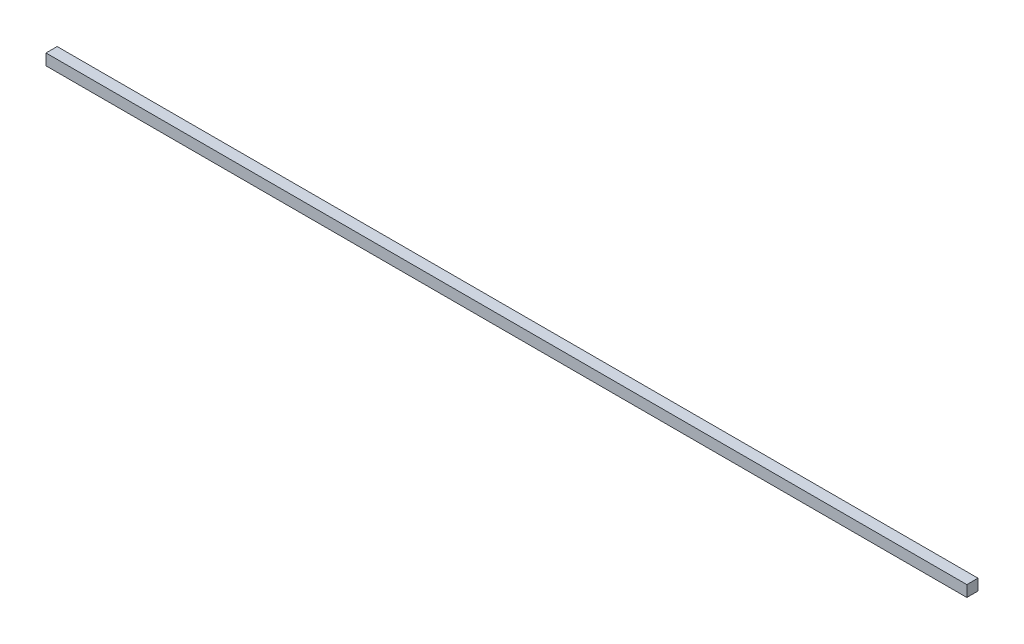
ISO-10303-21;
HEADER;
FILE_DESCRIPTION(('STEP AP214'),'2;1');
FILE_NAME('part.step','',(''),(''),'','','');
FILE_SCHEMA(('AUTOMOTIVE_DESIGN { 1 0 10303 214 1 1 1 1 }'));
ENDSEC;
DATA;
#1=APPLICATION_CONTEXT('core data for automotive mechanical design processes');
#2=APPLICATION_PROTOCOL_DEFINITION('international standard','automotive_design',2000,#1);
#3=PRODUCT_CONTEXT('',#1,'mechanical');
#4=PRODUCT('Part','Part','',(#3));
#5=PRODUCT_RELATED_PRODUCT_CATEGORY('part','',(#4));
#6=PRODUCT_DEFINITION_FORMATION('','',#4);
#7=PRODUCT_DEFINITION_CONTEXT('part definition',#1,'design');
#8=PRODUCT_DEFINITION('design','',#6,#7);
#9=PRODUCT_DEFINITION_SHAPE('','',#8);
#10=(LENGTH_UNIT() NAMED_UNIT(*) SI_UNIT(.MILLI.,.METRE.));
#11=(NAMED_UNIT(*) PLANE_ANGLE_UNIT() SI_UNIT($,.RADIAN.));
#12=(NAMED_UNIT(*) SI_UNIT($,.STERADIAN.) SOLID_ANGLE_UNIT());
#13=UNCERTAINTY_MEASURE_WITH_UNIT(LENGTH_MEASURE(1.E-05),#10,'distance_accuracy_value','');
#14=(GEOMETRIC_REPRESENTATION_CONTEXT(3) GLOBAL_UNCERTAINTY_ASSIGNED_CONTEXT((#13)) GLOBAL_UNIT_ASSIGNED_CONTEXT((#10,
#11,#12)) REPRESENTATION_CONTEXT('',''));
#15=CARTESIAN_POINT('',(0.,0.,0.));
#16=DIRECTION('',(0.,0.,1.));
#17=DIRECTION('',(1.,0.,0.));
#18=AXIS2_PLACEMENT_3D('',#15,#16,#17);
#19=CARTESIAN_POINT('',(20.,202.,30.));
#20=DIRECTION('',(1.,0.,0.));
#21=DIRECTION('',(0.,0.,-1.));
#22=AXIS2_PLACEMENT_3D('',#19,#20,#21);
#23=PLANE('',#22);
#24=DIRECTION('',(0.,-1.,0.));
#25=VECTOR('',#24,1.);
#26=CARTESIAN_POINT('',(20.,202.,22.));
#27=LINE('',#26,#25);
#28=CARTESIAN_POINT('',(20.,210.,22.));
#29=VERTEX_POINT('',#28);
#30=CARTESIAN_POINT('',(20.,202.,22.));
#31=VERTEX_POINT('',#30);
#32=EDGE_CURVE('E102',#29,#31,#27,.T.);
#33=ORIENTED_EDGE('',*,*,#32,.T.);
#34=DIRECTION('',(0.,0.,-1.));
#35=VECTOR('',#34,1.);
#36=CARTESIAN_POINT('',(20.,202.,30.));
#37=LINE('',#36,#35);
#38=CARTESIAN_POINT('',(20.,202.,30.));
#39=VERTEX_POINT('',#38);
#40=EDGE_CURVE('E11',#39,#31,#37,.T.);
#41=ORIENTED_EDGE('',*,*,#40,.F.);
#42=DIRECTION('',(0.,-1.,0.));
#43=VECTOR('',#42,1.);
#44=CARTESIAN_POINT('',(20.,202.,30.));
#45=LINE('',#44,#43);
#46=CARTESIAN_POINT('',(20.,210.,30.));
#47=VERTEX_POINT('',#46);
#48=EDGE_CURVE('E90',#47,#39,#45,.T.);
#49=ORIENTED_EDGE('',*,*,#48,.F.);
#50=DIRECTION('',(0.,0.,-1.));
#51=VECTOR('',#50,1.);
#52=CARTESIAN_POINT('',(20.,210.,30.));
#53=LINE('',#52,#51);
#54=EDGE_CURVE('E98',#47,#29,#53,.T.);
#55=ORIENTED_EDGE('',*,*,#54,.T.);
#56=EDGE_LOOP('',(#33,#41,#49,#55));
#57=FACE_BOUND('',#56,.T.);
#58=ADVANCED_FACE('F39',(#57),#23,.F.);
#59=CARTESIAN_POINT('',(20.,202.,30.));
#60=DIRECTION('',(0.,1.,0.));
#61=DIRECTION('',(0.,0.,1.));
#62=AXIS2_PLACEMENT_3D('',#59,#60,#61);
#63=PLANE('',#62);
#64=DIRECTION('',(1.,0.,0.));
#65=VECTOR('',#64,1.);
#66=CARTESIAN_POINT('',(20.,202.,22.));
#67=LINE('',#66,#65);
#68=CARTESIAN_POINT('',(680.,202.,22.));
#69=VERTEX_POINT('',#68);
#70=EDGE_CURVE('E94',#31,#69,#67,.T.);
#71=ORIENTED_EDGE('',*,*,#70,.T.);
#72=DIRECTION('',(0.,0.,-1.));
#73=VECTOR('',#72,1.);
#74=CARTESIAN_POINT('',(680.,202.,30.));
#75=LINE('',#74,#73);
#76=CARTESIAN_POINT('',(680.,202.,30.));
#77=VERTEX_POINT('',#76);
#78=EDGE_CURVE('E47',#77,#69,#75,.T.);
#79=ORIENTED_EDGE('',*,*,#78,.F.);
#80=DIRECTION('',(1.,0.,0.));
#81=VECTOR('',#80,1.);
#82=CARTESIAN_POINT('',(20.,202.,30.));
#83=LINE('',#82,#81);
#84=EDGE_CURVE('E85',#39,#77,#83,.T.);
#85=ORIENTED_EDGE('',*,*,#84,.F.);
#86=ORIENTED_EDGE('',*,*,#40,.T.);
#87=EDGE_LOOP('',(#71,#79,#85,#86));
#88=FACE_BOUND('',#87,.T.);
#89=ADVANCED_FACE('F93',(#88),#63,.F.);
#90=CARTESIAN_POINT('',(680.,202.,30.));
#91=DIRECTION('',(-1.,0.,0.));
#92=DIRECTION('',(0.,0.,1.));
#93=AXIS2_PLACEMENT_3D('',#90,#91,#92);
#94=PLANE('',#93);
#95=DIRECTION('',(0.,1.,0.));
#96=VECTOR('',#95,1.);
#97=CARTESIAN_POINT('',(680.,202.,22.));
#98=LINE('',#97,#96);
#99=CARTESIAN_POINT('',(680.,210.,22.));
#100=VERTEX_POINT('',#99);
#101=EDGE_CURVE('E72',#69,#100,#98,.T.);
#102=ORIENTED_EDGE('',*,*,#101,.T.);
#103=DIRECTION('',(0.,0.,-1.));
#104=VECTOR('',#103,1.);
#105=CARTESIAN_POINT('',(680.,210.,30.));
#106=LINE('',#105,#104);
#107=CARTESIAN_POINT('',(680.,210.,30.));
#108=VERTEX_POINT('',#107);
#109=EDGE_CURVE('E95',#108,#100,#106,.T.);
#110=ORIENTED_EDGE('',*,*,#109,.F.);
#111=DIRECTION('',(0.,1.,0.));
#112=VECTOR('',#111,1.);
#113=CARTESIAN_POINT('',(680.,202.,30.));
#114=LINE('',#113,#112);
#115=EDGE_CURVE('E88',#77,#108,#114,.T.);
#116=ORIENTED_EDGE('',*,*,#115,.F.);
#117=ORIENTED_EDGE('',*,*,#78,.T.);
#118=EDGE_LOOP('',(#102,#110,#116,#117));
#119=FACE_BOUND('',#118,.T.);
#120=ADVANCED_FACE('F96',(#119),#94,.F.);
#121=CARTESIAN_POINT('',(20.,210.,30.));
#122=DIRECTION('',(0.,-1.,0.));
#123=DIRECTION('',(0.,0.,-1.));
#124=AXIS2_PLACEMENT_3D('',#121,#122,#123);
#125=PLANE('',#124);
#126=DIRECTION('',(-1.,0.,0.));
#127=VECTOR('',#126,1.);
#128=CARTESIAN_POINT('',(20.,210.,22.));
#129=LINE('',#128,#127);
#130=EDGE_CURVE('E78',#100,#29,#129,.T.);
#131=ORIENTED_EDGE('',*,*,#130,.T.);
#132=ORIENTED_EDGE('',*,*,#54,.F.);
#133=DIRECTION('',(-1.,0.,0.));
#134=VECTOR('',#133,1.);
#135=CARTESIAN_POINT('',(20.,210.,30.));
#136=LINE('',#135,#134);
#137=EDGE_CURVE('E55',#108,#47,#136,.T.);
#138=ORIENTED_EDGE('',*,*,#137,.F.);
#139=ORIENTED_EDGE('',*,*,#109,.T.);
#140=EDGE_LOOP('',(#131,#132,#138,#139));
#141=FACE_BOUND('',#140,.T.);
#142=ADVANCED_FACE('F109',(#141),#125,.F.);
#143=CARTESIAN_POINT('',(0.,0.,30.));
#144=DIRECTION('',(0.,0.,-1.));
#145=DIRECTION('',(-1.,0.,0.));
#146=AXIS2_PLACEMENT_3D('',#143,#144,#145);
#147=PLANE('',#146);
#148=ORIENTED_EDGE('',*,*,#48,.T.);
#149=ORIENTED_EDGE('',*,*,#84,.T.);
#150=ORIENTED_EDGE('',*,*,#115,.T.);
#151=ORIENTED_EDGE('',*,*,#137,.T.);
#152=EDGE_LOOP('',(#148,#149,#150,#151));
#153=FACE_BOUND('',#152,.T.);
#154=ADVANCED_FACE('F86',(#153),#147,.F.);
#155=CARTESIAN_POINT('',(0.,0.,22.));
#156=DIRECTION('',(0.,0.,-1.));
#157=DIRECTION('',(-1.,0.,0.));
#158=AXIS2_PLACEMENT_3D('',#155,#156,#157);
#159=PLANE('',#158);
#160=ORIENTED_EDGE('',*,*,#32,.F.);
#161=ORIENTED_EDGE('',*,*,#130,.F.);
#162=ORIENTED_EDGE('',*,*,#101,.F.);
#163=ORIENTED_EDGE('',*,*,#70,.F.);
#164=EDGE_LOOP('',(#160,#161,#162,#163));
#165=FACE_BOUND('',#164,.T.);
#166=ADVANCED_FACE('F112',(#165),#159,.T.);
#167=CLOSED_SHELL('',(#58,#89,#120,#142,#154,#166));
#168=MANIFOLD_SOLID_BREP('B2',#167);
#169=ADVANCED_BREP_SHAPE_REPRESENTATION('',(#18,#168),#14);
#170=SHAPE_DEFINITION_REPRESENTATION(#9,#169);
ENDSEC;
END-ISO-10303-21;
